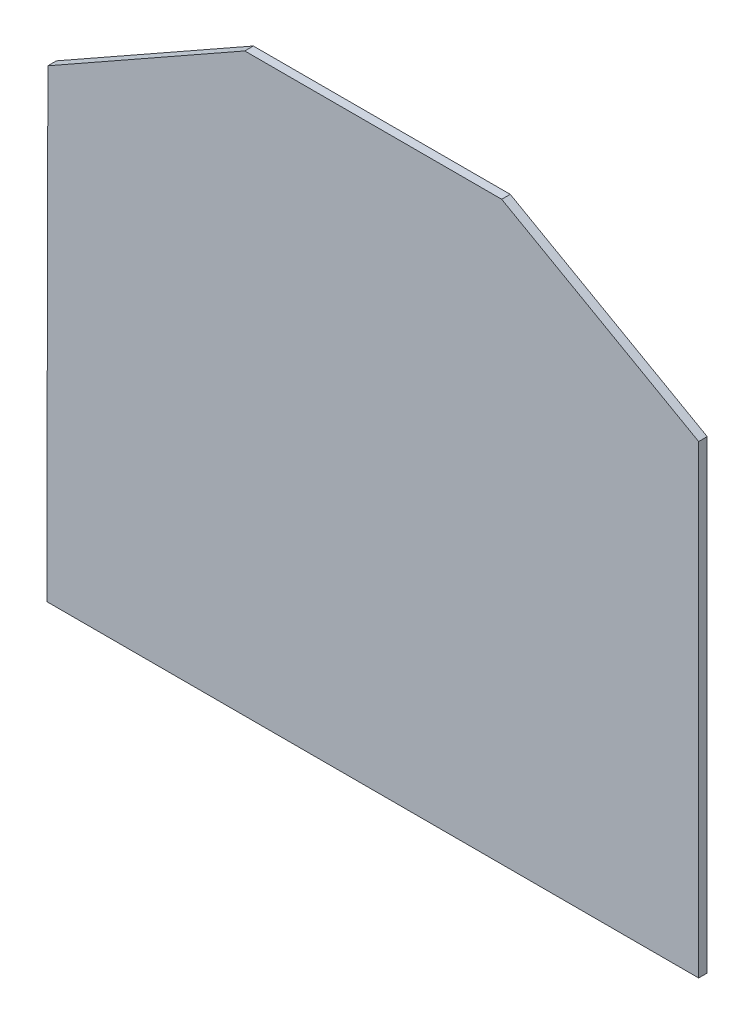
ISO-10303-21;
HEADER;
FILE_DESCRIPTION(('STEP AP214'),'2;1');
FILE_NAME('part.step','',(''),(''),'','','');
FILE_SCHEMA(('AUTOMOTIVE_DESIGN { 1 0 10303 214 1 1 1 1 }'));
ENDSEC;
DATA;
#1=APPLICATION_CONTEXT('core data for automotive mechanical design processes');
#2=APPLICATION_PROTOCOL_DEFINITION('international standard','automotive_design',2000,#1);
#3=PRODUCT_CONTEXT('',#1,'mechanical');
#4=PRODUCT('Part','Part','',(#3));
#5=PRODUCT_RELATED_PRODUCT_CATEGORY('part','',(#4));
#6=PRODUCT_DEFINITION_FORMATION('','',#4);
#7=PRODUCT_DEFINITION_CONTEXT('part definition',#1,'design');
#8=PRODUCT_DEFINITION('design','',#6,#7);
#9=PRODUCT_DEFINITION_SHAPE('','',#8);
#10=(LENGTH_UNIT() NAMED_UNIT(*) SI_UNIT(.MILLI.,.METRE.));
#11=(NAMED_UNIT(*) PLANE_ANGLE_UNIT() SI_UNIT($,.RADIAN.));
#12=(NAMED_UNIT(*) SI_UNIT($,.STERADIAN.) SOLID_ANGLE_UNIT());
#13=UNCERTAINTY_MEASURE_WITH_UNIT(LENGTH_MEASURE(1.E-05),#10,'distance_accuracy_value','');
#14=(GEOMETRIC_REPRESENTATION_CONTEXT(3) GLOBAL_UNCERTAINTY_ASSIGNED_CONTEXT((#13)) GLOBAL_UNIT_ASSIGNED_CONTEXT((#10,
#11,#12)) REPRESENTATION_CONTEXT('',''));
#15=CARTESIAN_POINT('',(0.,0.,0.));
#16=DIRECTION('',(0.,0.,1.));
#17=DIRECTION('',(1.,0.,0.));
#18=AXIS2_PLACEMENT_3D('',#15,#16,#17);
#19=CARTESIAN_POINT('',(380.,1260.,-700.));
#20=DIRECTION('',(-1.,0.,0.));
#21=DIRECTION('',(0.,1.,0.));
#22=AXIS2_PLACEMENT_3D('',#19,#20,#21);
#23=PLANE('',#22);
#24=DIRECTION('',(0.,-1.,0.));
#25=VECTOR('',#24,1.);
#26=CARTESIAN_POINT('',(380.,1260.,-690.));
#27=LINE('',#26,#25);
#28=CARTESIAN_POINT('',(380.,1260.,-690.));
#29=VERTEX_POINT('',#28);
#30=CARTESIAN_POINT('',(380.,717.5,-690.));
#31=VERTEX_POINT('',#30);
#32=EDGE_CURVE('E73',#29,#31,#27,.T.);
#33=ORIENTED_EDGE('',*,*,#32,.T.);
#34=DIRECTION('',(0.,0.,1.));
#35=VECTOR('',#34,1.);
#36=CARTESIAN_POINT('',(380.,717.5,-700.));
#37=LINE('',#36,#35);
#38=CARTESIAN_POINT('',(380.,717.5,-700.));
#39=VERTEX_POINT('',#38);
#40=EDGE_CURVE('E11',#39,#31,#37,.T.);
#41=ORIENTED_EDGE('',*,*,#40,.F.);
#42=DIRECTION('',(0.,-1.,0.));
#43=VECTOR('',#42,1.);
#44=CARTESIAN_POINT('',(380.,1260.,-700.));
#45=LINE('',#44,#43);
#46=CARTESIAN_POINT('',(380.,1260.,-700.));
#47=VERTEX_POINT('',#46);
#48=EDGE_CURVE('E94',#47,#39,#45,.T.);
#49=ORIENTED_EDGE('',*,*,#48,.F.);
#50=DIRECTION('',(0.,0.,1.));
#51=VECTOR('',#50,1.);
#52=CARTESIAN_POINT('',(380.,1260.,-700.));
#53=LINE('',#52,#51);
#54=EDGE_CURVE('E86',#47,#29,#53,.T.);
#55=ORIENTED_EDGE('',*,*,#54,.T.);
#56=EDGE_LOOP('',(#33,#41,#49,#55));
#57=FACE_BOUND('',#56,.T.);
#58=ADVANCED_FACE('F17',(#57),#23,.F.);
#59=CARTESIAN_POINT('',(380.,717.5,-700.));
#60=DIRECTION('',(0.,1.,0.));
#61=DIRECTION('',(1.,0.,0.));
#62=AXIS2_PLACEMENT_3D('',#59,#60,#61);
#63=PLANE('',#62);
#64=DIRECTION('',(-1.,0.,0.));
#65=VECTOR('',#64,1.);
#66=CARTESIAN_POINT('',(380.,717.5,-690.));
#67=LINE('',#66,#65);
#68=CARTESIAN_POINT('',(-381.208726415095,717.5,-690.));
#69=VERTEX_POINT('',#68);
#70=EDGE_CURVE('E69',#31,#69,#67,.T.);
#71=ORIENTED_EDGE('',*,*,#70,.T.);
#72=DIRECTION('',(0.,0.,1.));
#73=VECTOR('',#72,1.);
#74=CARTESIAN_POINT('',(-381.208726415095,717.5,-700.));
#75=LINE('',#74,#73);
#76=CARTESIAN_POINT('',(-381.208726415095,717.5,-700.));
#77=VERTEX_POINT('',#76);
#78=EDGE_CURVE('E24',#77,#69,#75,.T.);
#79=ORIENTED_EDGE('',*,*,#78,.F.);
#80=DIRECTION('',(-1.,0.,0.));
#81=VECTOR('',#80,1.);
#82=CARTESIAN_POINT('',(380.,717.5,-700.));
#83=LINE('',#82,#81);
#84=EDGE_CURVE('E82',#39,#77,#83,.T.);
#85=ORIENTED_EDGE('',*,*,#84,.F.);
#86=ORIENTED_EDGE('',*,*,#40,.T.);
#87=EDGE_LOOP('',(#71,#79,#85,#86));
#88=FACE_BOUND('',#87,.T.);
#89=ADVANCED_FACE('F81',(#88),#63,.F.);
#90=CARTESIAN_POINT('',(-381.208726415095,717.5,-700.));
#91=DIRECTION('',(0.999997218772728,-0.00235848400653946,0.));
#92=DIRECTION('',(-0.00235848400653946,-0.999997218772728,0.));
#93=AXIS2_PLACEMENT_3D('',#90,#91,#92);
#94=PLANE('',#93);
#95=DIRECTION('',(0.00235848400653946,0.999997218772728,0.));
#96=VECTOR('',#95,1.);
#97=CARTESIAN_POINT('',(-381.208726415095,717.5,-690.));
#98=LINE('',#97,#96);
#99=CARTESIAN_POINT('',(-379.929150836841,1260.04004517918,-690.));
#100=VERTEX_POINT('',#99);
#101=EDGE_CURVE('E75',#69,#100,#98,.T.);
#102=ORIENTED_EDGE('',*,*,#101,.T.);
#103=DIRECTION('',(0.,0.,1.));
#104=VECTOR('',#103,1.);
#105=CARTESIAN_POINT('',(-379.929150836841,1260.04004517918,-700.));
#106=LINE('',#105,#104);
#107=CARTESIAN_POINT('',(-379.929150836841,1260.04004517918,-700.));
#108=VERTEX_POINT('',#107);
#109=EDGE_CURVE('E108',#108,#100,#106,.T.);
#110=ORIENTED_EDGE('',*,*,#109,.F.);
#111=DIRECTION('',(0.00235848400653946,0.999997218772728,0.));
#112=VECTOR('',#111,1.);
#113=CARTESIAN_POINT('',(-381.208726415095,717.5,-700.));
#114=LINE('',#113,#112);
#115=EDGE_CURVE('E93',#77,#108,#114,.T.);
#116=ORIENTED_EDGE('',*,*,#115,.F.);
#117=ORIENTED_EDGE('',*,*,#78,.T.);
#118=EDGE_LOOP('',(#102,#110,#116,#117));
#119=FACE_BOUND('',#118,.T.);
#120=ADVANCED_FACE('F112',(#119),#94,.F.);
#121=CARTESIAN_POINT('',(-379.929150836841,1260.04004517918,-700.));
#122=DIRECTION('',(0.492057256667902,-0.870562838720134,0.));
#123=DIRECTION('',(-0.870562838720134,-0.492057256667902,0.));
#124=AXIS2_PLACEMENT_3D('',#121,#122,#123);
#125=PLANE('',#124);
#126=DIRECTION('',(0.870562838720134,0.492057256667902,0.));
#127=VECTOR('',#126,1.);
#128=CARTESIAN_POINT('',(-379.929150836841,1260.04004517918,-690.));
#129=LINE('',#128,#127);
#130=CARTESIAN_POINT('',(-150.000000000005,1390.,-690.));
#131=VERTEX_POINT('',#130);
#132=EDGE_CURVE('E119',#100,#131,#129,.T.);
#133=ORIENTED_EDGE('',*,*,#132,.T.);
#134=DIRECTION('',(0.,0.,1.));
#135=VECTOR('',#134,1.);
#136=CARTESIAN_POINT('',(-150.000000000005,1390.,-700.));
#137=LINE('',#136,#135);
#138=CARTESIAN_POINT('',(-150.000000000005,1390.,-700.));
#139=VERTEX_POINT('',#138);
#140=EDGE_CURVE('E105',#139,#131,#137,.T.);
#141=ORIENTED_EDGE('',*,*,#140,.F.);
#142=DIRECTION('',(0.870562838720134,0.492057256667902,0.));
#143=VECTOR('',#142,1.);
#144=CARTESIAN_POINT('',(-379.929150836841,1260.04004517918,-700.));
#145=LINE('',#144,#143);
#146=EDGE_CURVE('E96',#108,#139,#145,.T.);
#147=ORIENTED_EDGE('',*,*,#146,.F.);
#148=ORIENTED_EDGE('',*,*,#109,.T.);
#149=EDGE_LOOP('',(#133,#141,#147,#148));
#150=FACE_BOUND('',#149,.T.);
#151=ADVANCED_FACE('F118',(#150),#125,.F.);
#152=CARTESIAN_POINT('',(-150.000000000005,1390.,-700.));
#153=DIRECTION('',(0.,-1.,0.));
#154=DIRECTION('',(-1.,0.,0.));
#155=AXIS2_PLACEMENT_3D('',#152,#153,#154);
#156=PLANE('',#155);
#157=DIRECTION('',(1.,0.,0.));
#158=VECTOR('',#157,1.);
#159=CARTESIAN_POINT('',(-150.000000000005,1390.,-690.));
#160=LINE('',#159,#158);
#161=CARTESIAN_POINT('',(150.,1390.,-690.));
#162=VERTEX_POINT('',#161);
#163=EDGE_CURVE('E123',#131,#162,#160,.T.);
#164=ORIENTED_EDGE('',*,*,#163,.T.);
#165=DIRECTION('',(0.,0.,1.));
#166=VECTOR('',#165,1.);
#167=CARTESIAN_POINT('',(150.,1390.,-700.));
#168=LINE('',#167,#166);
#169=CARTESIAN_POINT('',(150.,1390.,-700.));
#170=VERTEX_POINT('',#169);
#171=EDGE_CURVE('E102',#170,#162,#168,.T.);
#172=ORIENTED_EDGE('',*,*,#171,.F.);
#173=DIRECTION('',(1.,0.,0.));
#174=VECTOR('',#173,1.);
#175=CARTESIAN_POINT('',(-150.000000000005,1390.,-700.));
#176=LINE('',#175,#174);
#177=EDGE_CURVE('E36',#139,#170,#176,.T.);
#178=ORIENTED_EDGE('',*,*,#177,.F.);
#179=ORIENTED_EDGE('',*,*,#140,.T.);
#180=EDGE_LOOP('',(#164,#172,#178,#179));
#181=FACE_BOUND('',#180,.T.);
#182=ADVANCED_FACE('F122',(#181),#156,.F.);
#183=CARTESIAN_POINT('',(150.,1390.,-700.));
#184=DIRECTION('',(-0.492057256667902,-0.870562838720134,0.));
#185=DIRECTION('',(-0.870562838720134,0.492057256667902,0.));
#186=AXIS2_PLACEMENT_3D('',#183,#184,#185);
#187=PLANE('',#186);
#188=DIRECTION('',(0.870562838720134,-0.492057256667902,0.));
#189=VECTOR('',#188,1.);
#190=CARTESIAN_POINT('',(150.,1390.,-690.));
#191=LINE('',#190,#189);
#192=EDGE_CURVE('E90',#162,#29,#191,.T.);
#193=ORIENTED_EDGE('',*,*,#192,.T.);
#194=ORIENTED_EDGE('',*,*,#54,.F.);
#195=DIRECTION('',(0.870562838720134,-0.492057256667902,0.));
#196=VECTOR('',#195,1.);
#197=CARTESIAN_POINT('',(150.,1390.,-700.));
#198=LINE('',#197,#196);
#199=EDGE_CURVE('E31',#170,#47,#198,.T.);
#200=ORIENTED_EDGE('',*,*,#199,.F.);
#201=ORIENTED_EDGE('',*,*,#171,.T.);
#202=EDGE_LOOP('',(#193,#194,#200,#201));
#203=FACE_BOUND('',#202,.T.);
#204=ADVANCED_FACE('F125',(#203),#187,.F.);
#205=CARTESIAN_POINT('',(380.,717.5,-700.));
#206=DIRECTION('',(0.,0.,-1.));
#207=DIRECTION('',(0.,-1.,0.));
#208=AXIS2_PLACEMENT_3D('',#205,#206,#207);
#209=PLANE('',#208);
#210=ORIENTED_EDGE('',*,*,#48,.T.);
#211=ORIENTED_EDGE('',*,*,#84,.T.);
#212=ORIENTED_EDGE('',*,*,#115,.T.);
#213=ORIENTED_EDGE('',*,*,#146,.T.);
#214=ORIENTED_EDGE('',*,*,#177,.T.);
#215=ORIENTED_EDGE('',*,*,#199,.T.);
#216=EDGE_LOOP('',(#210,#211,#212,#213,#214,#215));
#217=FACE_BOUND('',#216,.T.);
#218=ADVANCED_FACE('F115',(#217),#209,.T.);
#219=CARTESIAN_POINT('',(380.,717.5,-690.));
#220=DIRECTION('',(0.,0.,-1.));
#221=DIRECTION('',(0.,-1.,0.));
#222=AXIS2_PLACEMENT_3D('',#219,#220,#221);
#223=PLANE('',#222);
#224=ORIENTED_EDGE('',*,*,#32,.F.);
#225=ORIENTED_EDGE('',*,*,#192,.F.);
#226=ORIENTED_EDGE('',*,*,#163,.F.);
#227=ORIENTED_EDGE('',*,*,#132,.F.);
#228=ORIENTED_EDGE('',*,*,#101,.F.);
#229=ORIENTED_EDGE('',*,*,#70,.F.);
#230=EDGE_LOOP('',(#224,#225,#226,#227,#228,#229));
#231=FACE_BOUND('',#230,.T.);
#232=ADVANCED_FACE('F70',(#231),#223,.F.);
#233=CLOSED_SHELL('',(#58,#89,#120,#151,#182,#204,#218,#232));
#234=MANIFOLD_SOLID_BREP('B1',#233);
#235=ADVANCED_BREP_SHAPE_REPRESENTATION('',(#18,#234),#14);
#236=SHAPE_DEFINITION_REPRESENTATION(#9,#235);
ENDSEC;
END-ISO-10303-21;
